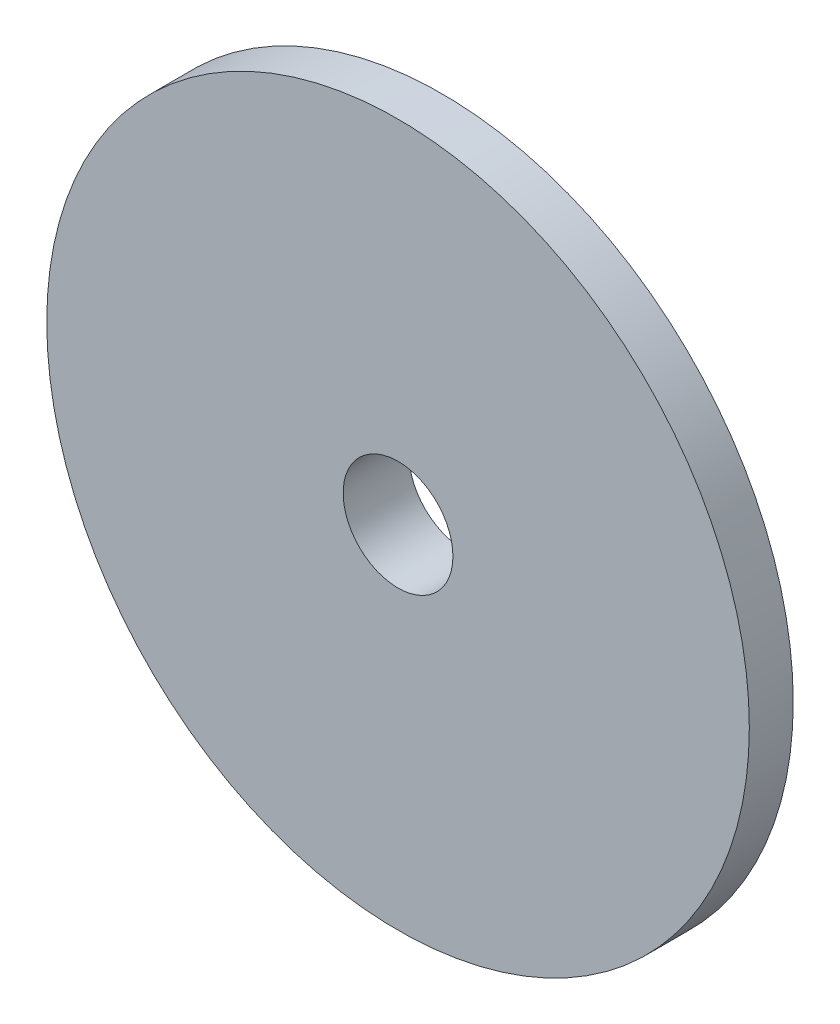
ISO-10303-21;
HEADER;
FILE_DESCRIPTION(('STEP AP214'),'2;1');
FILE_NAME('part.step','',(''),(''),'','','');
FILE_SCHEMA(('AUTOMOTIVE_DESIGN { 1 0 10303 214 1 1 1 1 }'));
ENDSEC;
DATA;
#1=APPLICATION_CONTEXT('core data for automotive mechanical design processes');
#2=APPLICATION_PROTOCOL_DEFINITION('international standard','automotive_design',2000,#1);
#3=PRODUCT_CONTEXT('',#1,'mechanical');
#4=PRODUCT('Part','Part','',(#3));
#5=PRODUCT_RELATED_PRODUCT_CATEGORY('part','',(#4));
#6=PRODUCT_DEFINITION_FORMATION('','',#4);
#7=PRODUCT_DEFINITION_CONTEXT('part definition',#1,'design');
#8=PRODUCT_DEFINITION('design','',#6,#7);
#9=PRODUCT_DEFINITION_SHAPE('','',#8);
#10=(LENGTH_UNIT() NAMED_UNIT(*) SI_UNIT(.MILLI.,.METRE.));
#11=(NAMED_UNIT(*) PLANE_ANGLE_UNIT() SI_UNIT($,.RADIAN.));
#12=(NAMED_UNIT(*) SI_UNIT($,.STERADIAN.) SOLID_ANGLE_UNIT());
#13=UNCERTAINTY_MEASURE_WITH_UNIT(LENGTH_MEASURE(1.E-05),#10,'distance_accuracy_value','');
#14=(GEOMETRIC_REPRESENTATION_CONTEXT(3) GLOBAL_UNCERTAINTY_ASSIGNED_CONTEXT((#13)) GLOBAL_UNIT_ASSIGNED_CONTEXT((#10,
#11,#12)) REPRESENTATION_CONTEXT('',''));
#15=CARTESIAN_POINT('',(0.,0.,0.));
#16=DIRECTION('',(0.,0.,1.));
#17=DIRECTION('',(1.,0.,0.));
#18=AXIS2_PLACEMENT_3D('',#15,#16,#17);
#19=CARTESIAN_POINT('',(0.,0.,0.));
#20=DIRECTION('',(0.,0.,1.));
#21=DIRECTION('',(1.,0.,0.));
#22=AXIS2_PLACEMENT_3D('',#19,#20,#21);
#23=PLANE('',#22);
#24=CARTESIAN_POINT('',(0.,0.,0.));
#25=DIRECTION('',(0.,0.,1.));
#26=DIRECTION('',(1.,0.,0.));
#27=AXIS2_PLACEMENT_3D('',#24,#25,#26);
#28=CIRCLE('',#27,19.95);
#29=CARTESIAN_POINT('',(19.95,0.,0.));
#30=VERTEX_POINT('',#29);
#31=EDGE_CURVE('E45',#30,#30,#28,.T.);
#32=ORIENTED_EDGE('',*,*,#31,.F.);
#33=EDGE_LOOP('',(#32));
#34=FACE_BOUND('',#33,.T.);
#35=CARTESIAN_POINT('',(0.,0.,0.));
#36=DIRECTION('',(0.,0.,1.));
#37=DIRECTION('',(1.,0.,0.));
#38=AXIS2_PLACEMENT_3D('',#35,#36,#37);
#39=CIRCLE('',#38,5.);
#40=CARTESIAN_POINT('',(5.,0.,0.));
#41=VERTEX_POINT('',#40);
#42=EDGE_CURVE('E55',#41,#41,#39,.T.);
#43=ORIENTED_EDGE('',*,*,#42,.T.);
#44=EDGE_LOOP('',(#43));
#45=FACE_BOUND('',#44,.T.);
#46=ADVANCED_FACE('F41',(#34,#45),#23,.F.);
#47=CARTESIAN_POINT('',(0.,0.,2.));
#48=DIRECTION('',(0.,0.,-1.));
#49=DIRECTION('',(-1.,0.,0.));
#50=AXIS2_PLACEMENT_3D('',#47,#48,#49);
#51=CYLINDRICAL_SURFACE('',#50,19.95);
#52=CARTESIAN_POINT('',(0.,0.,2.));
#53=DIRECTION('',(0.,0.,1.));
#54=DIRECTION('',(1.,0.,0.));
#55=AXIS2_PLACEMENT_3D('',#52,#53,#54);
#56=CIRCLE('',#55,19.95);
#57=CARTESIAN_POINT('',(19.95,0.,2.));
#58=VERTEX_POINT('',#57);
#59=EDGE_CURVE('E10',#58,#58,#56,.T.);
#60=ORIENTED_EDGE('',*,*,#59,.F.);
#61=EDGE_LOOP('',(#60));
#62=FACE_BOUND('',#61,.T.);
#63=ORIENTED_EDGE('',*,*,#31,.T.);
#64=EDGE_LOOP('',(#63));
#65=FACE_BOUND('',#64,.T.);
#66=ADVANCED_FACE('F43',(#62,#65),#51,.T.);
#67=CARTESIAN_POINT('',(0.,0.,2.));
#68=DIRECTION('',(0.,0.,-1.));
#69=DIRECTION('',(-1.,0.,0.));
#70=AXIS2_PLACEMENT_3D('',#67,#68,#69);
#71=CYLINDRICAL_SURFACE('',#70,5.);
#72=ORIENTED_EDGE('',*,*,#42,.F.);
#73=EDGE_LOOP('',(#72));
#74=FACE_BOUND('',#73,.T.);
#75=CARTESIAN_POINT('',(0.,0.,6.));
#76=DIRECTION('',(0.,0.,1.));
#77=DIRECTION('',(1.,0.,0.));
#78=AXIS2_PLACEMENT_3D('',#75,#76,#77);
#79=CIRCLE('',#78,5.);
#80=CARTESIAN_POINT('',(5.,0.,6.));
#81=VERTEX_POINT('',#80);
#82=EDGE_CURVE('E65',#81,#81,#79,.T.);
#83=ORIENTED_EDGE('',*,*,#82,.T.);
#84=EDGE_LOOP('',(#83));
#85=FACE_BOUND('',#84,.T.);
#86=ADVANCED_FACE('F74',(#74,#85),#71,.F.);
#87=CARTESIAN_POINT('',(0.,0.,6.));
#88=DIRECTION('',(0.,0.,1.));
#89=DIRECTION('',(1.,0.,0.));
#90=AXIS2_PLACEMENT_3D('',#87,#88,#89);
#91=PLANE('',#90);
#92=CARTESIAN_POINT('',(0.,0.,6.));
#93=DIRECTION('',(0.,0.,1.));
#94=DIRECTION('',(1.,0.,0.));
#95=AXIS2_PLACEMENT_3D('',#92,#93,#94);
#96=CIRCLE('',#95,32.);
#97=CARTESIAN_POINT('',(32.,0.,6.));
#98=VERTEX_POINT('',#97);
#99=EDGE_CURVE('E60',#98,#98,#96,.T.);
#100=ORIENTED_EDGE('',*,*,#99,.T.);
#101=EDGE_LOOP('',(#100));
#102=FACE_BOUND('',#101,.T.);
#103=ORIENTED_EDGE('',*,*,#82,.F.);
#104=EDGE_LOOP('',(#103));
#105=FACE_BOUND('',#104,.T.);
#106=ADVANCED_FACE('F76',(#102,#105),#91,.T.);
#107=CARTESIAN_POINT('',(0.,0.,2.));
#108=DIRECTION('',(0.,0.,1.));
#109=DIRECTION('',(1.,0.,0.));
#110=AXIS2_PLACEMENT_3D('',#107,#108,#109);
#111=PLANE('',#110);
#112=ORIENTED_EDGE('',*,*,#59,.T.);
#113=EDGE_LOOP('',(#112));
#114=FACE_BOUND('',#113,.T.);
#115=CARTESIAN_POINT('',(0.,0.,2.));
#116=DIRECTION('',(0.,0.,1.));
#117=DIRECTION('',(1.,0.,0.));
#118=AXIS2_PLACEMENT_3D('',#115,#116,#117);
#119=CIRCLE('',#118,32.);
#120=CARTESIAN_POINT('',(32.,0.,2.));
#121=VERTEX_POINT('',#120);
#122=EDGE_CURVE('E61',#121,#121,#119,.T.);
#123=ORIENTED_EDGE('',*,*,#122,.F.);
#124=EDGE_LOOP('',(#123));
#125=FACE_BOUND('',#124,.T.);
#126=ADVANCED_FACE('F78',(#114,#125),#111,.F.);
#127=CARTESIAN_POINT('',(0.,0.,6.));
#128=DIRECTION('',(0.,0.,-1.));
#129=DIRECTION('',(-1.,0.,0.));
#130=AXIS2_PLACEMENT_3D('',#127,#128,#129);
#131=CYLINDRICAL_SURFACE('',#130,32.);
#132=ORIENTED_EDGE('',*,*,#99,.F.);
#133=EDGE_LOOP('',(#132));
#134=FACE_BOUND('',#133,.T.);
#135=ORIENTED_EDGE('',*,*,#122,.T.);
#136=EDGE_LOOP('',(#135));
#137=FACE_BOUND('',#136,.T.);
#138=ADVANCED_FACE('F85',(#134,#137),#131,.T.);
#139=CLOSED_SHELL('',(#46,#66,#86,#106,#126,#138));
#140=MANIFOLD_SOLID_BREP('B2',#139);
#141=ADVANCED_BREP_SHAPE_REPRESENTATION('',(#18,#140),#14);
#142=SHAPE_DEFINITION_REPRESENTATION(#9,#141);
ENDSEC;
END-ISO-10303-21;
